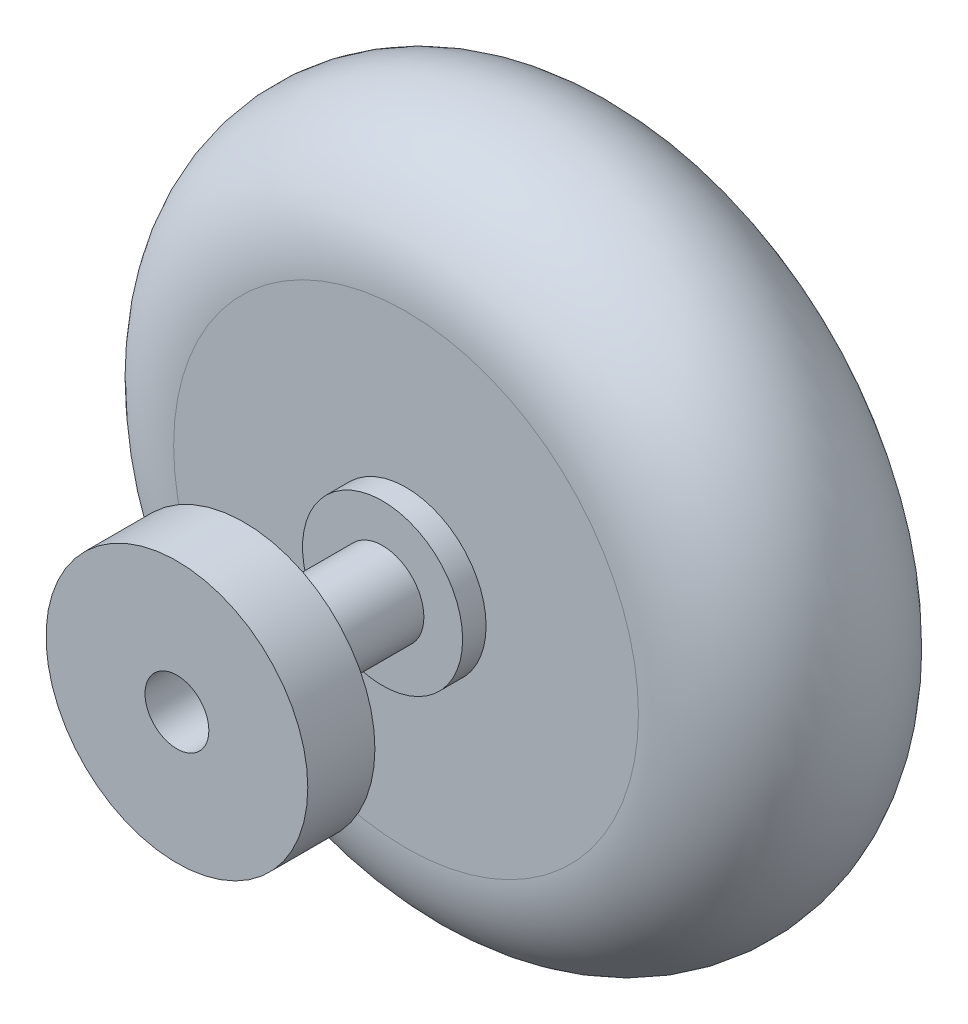
ISO-10303-21;
HEADER;
FILE_DESCRIPTION(('STEP AP214'),'2;1');
FILE_NAME('part.step','',(''),(''),'','','');
FILE_SCHEMA(('AUTOMOTIVE_DESIGN { 1 0 10303 214 1 1 1 1 }'));
ENDSEC;
DATA;
#1=APPLICATION_CONTEXT('core data for automotive mechanical design processes');
#2=APPLICATION_PROTOCOL_DEFINITION('international standard','automotive_design',2000,#1);
#3=PRODUCT_CONTEXT('',#1,'mechanical');
#4=PRODUCT('Part','Part','',(#3));
#5=PRODUCT_RELATED_PRODUCT_CATEGORY('part','',(#4));
#6=PRODUCT_DEFINITION_FORMATION('','',#4);
#7=PRODUCT_DEFINITION_CONTEXT('part definition',#1,'design');
#8=PRODUCT_DEFINITION('design','',#6,#7);
#9=PRODUCT_DEFINITION_SHAPE('','',#8);
#10=(LENGTH_UNIT() NAMED_UNIT(*) SI_UNIT(.MILLI.,.METRE.));
#11=(NAMED_UNIT(*) PLANE_ANGLE_UNIT() SI_UNIT($,.RADIAN.));
#12=(NAMED_UNIT(*) SI_UNIT($,.STERADIAN.) SOLID_ANGLE_UNIT());
#13=UNCERTAINTY_MEASURE_WITH_UNIT(LENGTH_MEASURE(1.E-05),#10,'distance_accuracy_value','');
#14=(GEOMETRIC_REPRESENTATION_CONTEXT(3) GLOBAL_UNCERTAINTY_ASSIGNED_CONTEXT((#13)) GLOBAL_UNIT_ASSIGNED_CONTEXT((#10,
#11,#12)) REPRESENTATION_CONTEXT('',''));
#15=CARTESIAN_POINT('',(0.,0.,0.));
#16=DIRECTION('',(0.,0.,1.));
#17=DIRECTION('',(1.,0.,0.));
#18=AXIS2_PLACEMENT_3D('',#15,#16,#17);
#19=CARTESIAN_POINT('',(0.,0.,-5.));
#20=DIRECTION('',(0.,0.,1.));
#21=DIRECTION('',(1.,0.,0.));
#22=AXIS2_PLACEMENT_3D('',#19,#20,#21);
#23=TOROIDAL_SURFACE('',#22,9.9,5.);
#24=CARTESIAN_POINT('',(0.,0.,-10.));
#25=DIRECTION('',(0.,0.,1.));
#26=DIRECTION('',(1.,0.,0.));
#27=AXIS2_PLACEMENT_3D('',#24,#25,#26);
#28=CIRCLE('',#27,9.9);
#29=CARTESIAN_POINT('',(9.9,0.,-10.));
#30=VERTEX_POINT('',#29);
#31=EDGE_CURVE('E116',#30,#30,#28,.F.);
#32=ORIENTED_EDGE('',*,*,#31,.F.);
#33=EDGE_LOOP('',(#32));
#34=FACE_BOUND('',#33,.T.);
#35=CARTESIAN_POINT('',(0.,0.,0.));
#36=DIRECTION('',(0.,0.,1.));
#37=DIRECTION('',(1.,0.,0.));
#38=AXIS2_PLACEMENT_3D('',#35,#36,#37);
#39=CIRCLE('',#38,9.9);
#40=CARTESIAN_POINT('',(9.9,0.,0.));
#41=VERTEX_POINT('',#40);
#42=EDGE_CURVE('E111',#41,#41,#39,.T.);
#43=ORIENTED_EDGE('',*,*,#42,.F.);
#44=EDGE_LOOP('',(#43));
#45=FACE_BOUND('',#44,.T.);
#46=ADVANCED_FACE('F42',(#34,#45),#23,.T.);
#47=CARTESIAN_POINT('',(0.,0.,-10.));
#48=DIRECTION('',(0.,0.,1.));
#49=DIRECTION('',(1.,0.,0.));
#50=AXIS2_PLACEMENT_3D('',#47,#48,#49);
#51=PLANE('',#50);
#52=CARTESIAN_POINT('',(0.,0.,-10.));
#53=DIRECTION('',(0.,0.,1.));
#54=DIRECTION('',(1.,0.,0.));
#55=AXIS2_PLACEMENT_3D('',#52,#53,#54);
#56=CIRCLE('',#55,3.405);
#57=CARTESIAN_POINT('',(3.405,0.,-10.));
#58=VERTEX_POINT('',#57);
#59=EDGE_CURVE('E46',#58,#58,#56,.F.);
#60=ORIENTED_EDGE('',*,*,#59,.F.);
#61=EDGE_LOOP('',(#60));
#62=FACE_BOUND('',#61,.T.);
#63=ORIENTED_EDGE('',*,*,#31,.T.);
#64=EDGE_LOOP('',(#63));
#65=FACE_BOUND('',#64,.T.);
#66=ADVANCED_FACE('F130',(#62,#65),#51,.F.);
#67=CARTESIAN_POINT('',(0.,0.,0.));
#68=DIRECTION('',(0.,0.,1.));
#69=DIRECTION('',(1.,0.,0.));
#70=AXIS2_PLACEMENT_3D('',#67,#68,#69);
#71=PLANE('',#70);
#72=CARTESIAN_POINT('',(0.,0.,0.));
#73=DIRECTION('',(0.,0.,1.));
#74=DIRECTION('',(1.,0.,0.));
#75=AXIS2_PLACEMENT_3D('',#72,#73,#74);
#76=CIRCLE('',#75,3.41);
#77=CARTESIAN_POINT('',(3.41,0.,0.));
#78=VERTEX_POINT('',#77);
#79=EDGE_CURVE('E106',#78,#78,#76,.T.);
#80=ORIENTED_EDGE('',*,*,#79,.F.);
#81=EDGE_LOOP('',(#80));
#82=FACE_BOUND('',#81,.T.);
#83=ORIENTED_EDGE('',*,*,#42,.T.);
#84=EDGE_LOOP('',(#83));
#85=FACE_BOUND('',#84,.T.);
#86=ADVANCED_FACE('F127',(#82,#85),#71,.T.);
#87=CARTESIAN_POINT('',(0.,0.,1.));
#88=DIRECTION('',(0.,0.,-1.));
#89=DIRECTION('',(-1.,0.,0.));
#90=AXIS2_PLACEMENT_3D('',#87,#88,#89);
#91=CYLINDRICAL_SURFACE('',#90,3.41);
#92=CARTESIAN_POINT('',(0.,0.,1.));
#93=DIRECTION('',(0.,0.,1.));
#94=DIRECTION('',(1.,0.,0.));
#95=AXIS2_PLACEMENT_3D('',#92,#93,#94);
#96=CIRCLE('',#95,3.41);
#97=CARTESIAN_POINT('',(3.41,0.,1.));
#98=VERTEX_POINT('',#97);
#99=EDGE_CURVE('E112',#98,#98,#96,.T.);
#100=ORIENTED_EDGE('',*,*,#99,.F.);
#101=EDGE_LOOP('',(#100));
#102=FACE_BOUND('',#101,.T.);
#103=ORIENTED_EDGE('',*,*,#79,.T.);
#104=EDGE_LOOP('',(#103));
#105=FACE_BOUND('',#104,.T.);
#106=ADVANCED_FACE('F142',(#102,#105),#91,.T.);
#107=CARTESIAN_POINT('',(0.,0.,1.));
#108=DIRECTION('',(0.,0.,1.));
#109=DIRECTION('',(1.,0.,0.));
#110=AXIS2_PLACEMENT_3D('',#107,#108,#109);
#111=PLANE('',#110);
#112=CARTESIAN_POINT('',(0.,0.,1.));
#113=DIRECTION('',(0.,0.,1.));
#114=DIRECTION('',(1.,0.,0.));
#115=AXIS2_PLACEMENT_3D('',#112,#113,#114);
#116=CIRCLE('',#115,1.76);
#117=CARTESIAN_POINT('',(1.76,0.,1.));
#118=VERTEX_POINT('',#117);
#119=EDGE_CURVE('E107',#118,#118,#116,.T.);
#120=ORIENTED_EDGE('',*,*,#119,.F.);
#121=EDGE_LOOP('',(#120));
#122=FACE_BOUND('',#121,.T.);
#123=ORIENTED_EDGE('',*,*,#99,.T.);
#124=EDGE_LOOP('',(#123));
#125=FACE_BOUND('',#124,.T.);
#126=ADVANCED_FACE('F148',(#122,#125),#111,.T.);
#127=CARTESIAN_POINT('',(0.,0.,6.9));
#128=DIRECTION('',(0.,0.,-1.));
#129=DIRECTION('',(-1.,0.,0.));
#130=AXIS2_PLACEMENT_3D('',#127,#128,#129);
#131=CYLINDRICAL_SURFACE('',#130,1.76);
#132=CARTESIAN_POINT('',(0.,0.,6.9));
#133=DIRECTION('',(0.,0.,1.));
#134=DIRECTION('',(1.,0.,0.));
#135=AXIS2_PLACEMENT_3D('',#132,#133,#134);
#136=CIRCLE('',#135,1.76);
#137=CARTESIAN_POINT('',(1.76,0.,6.9));
#138=VERTEX_POINT('',#137);
#139=EDGE_CURVE('E99',#138,#138,#136,.T.);
#140=ORIENTED_EDGE('',*,*,#139,.F.);
#141=EDGE_LOOP('',(#140));
#142=FACE_BOUND('',#141,.T.);
#143=ORIENTED_EDGE('',*,*,#119,.T.);
#144=EDGE_LOOP('',(#143));
#145=FACE_BOUND('',#144,.T.);
#146=ADVANCED_FACE('F152',(#142,#145),#131,.T.);
#147=CARTESIAN_POINT('',(0.,0.,9.76));
#148=DIRECTION('',(0.,0.,-1.));
#149=DIRECTION('',(-1.,0.,0.));
#150=AXIS2_PLACEMENT_3D('',#147,#148,#149);
#151=CYLINDRICAL_SURFACE('',#150,5.575);
#152=CARTESIAN_POINT('',(0.,0.,9.76));
#153=DIRECTION('',(0.,0.,1.));
#154=DIRECTION('',(1.,0.,0.));
#155=AXIS2_PLACEMENT_3D('',#152,#153,#154);
#156=CIRCLE('',#155,5.575);
#157=CARTESIAN_POINT('',(5.575,0.,9.76));
#158=VERTEX_POINT('',#157);
#159=EDGE_CURVE('E95',#158,#158,#156,.T.);
#160=ORIENTED_EDGE('',*,*,#159,.F.);
#161=EDGE_LOOP('',(#160));
#162=FACE_BOUND('',#161,.T.);
#163=CARTESIAN_POINT('',(0.,0.,6.9));
#164=DIRECTION('',(0.,0.,1.));
#165=DIRECTION('',(1.,0.,0.));
#166=AXIS2_PLACEMENT_3D('',#163,#164,#165);
#167=CIRCLE('',#166,5.575);
#168=CARTESIAN_POINT('',(5.575,0.,6.9));
#169=VERTEX_POINT('',#168);
#170=EDGE_CURVE('E91',#169,#169,#167,.T.);
#171=ORIENTED_EDGE('',*,*,#170,.T.);
#172=EDGE_LOOP('',(#171));
#173=FACE_BOUND('',#172,.T.);
#174=ADVANCED_FACE('F156',(#162,#173),#151,.T.);
#175=CARTESIAN_POINT('',(0.,0.,9.76));
#176=DIRECTION('',(0.,0.,1.));
#177=DIRECTION('',(1.,0.,0.));
#178=AXIS2_PLACEMENT_3D('',#175,#176,#177);
#179=PLANE('',#178);
#180=CARTESIAN_POINT('',(0.,0.,9.76));
#181=DIRECTION('',(0.,0.,1.));
#182=DIRECTION('',(1.,0.,0.));
#183=AXIS2_PLACEMENT_3D('',#180,#181,#182);
#184=CIRCLE('',#183,1.36);
#185=CARTESIAN_POINT('',(1.36,0.,9.76));
#186=VERTEX_POINT('',#185);
#187=EDGE_CURVE('E86',#186,#186,#184,.T.);
#188=ORIENTED_EDGE('',*,*,#187,.F.);
#189=EDGE_LOOP('',(#188));
#190=FACE_BOUND('',#189,.T.);
#191=ORIENTED_EDGE('',*,*,#159,.T.);
#192=EDGE_LOOP('',(#191));
#193=FACE_BOUND('',#192,.T.);
#194=ADVANCED_FACE('F160',(#190,#193),#179,.T.);
#195=CARTESIAN_POINT('',(0.,0.,6.9));
#196=DIRECTION('',(0.,0.,1.));
#197=DIRECTION('',(1.,0.,0.));
#198=AXIS2_PLACEMENT_3D('',#195,#196,#197);
#199=PLANE('',#198);
#200=ORIENTED_EDGE('',*,*,#139,.T.);
#201=EDGE_LOOP('',(#200));
#202=FACE_BOUND('',#201,.T.);
#203=ORIENTED_EDGE('',*,*,#170,.F.);
#204=EDGE_LOOP('',(#203));
#205=FACE_BOUND('',#204,.T.);
#206=ADVANCED_FACE('F162',(#202,#205),#199,.F.);
#207=CARTESIAN_POINT('',(0.,0.,6.9));
#208=DIRECTION('',(0.,0.,1.));
#209=DIRECTION('',(1.,0.,0.));
#210=AXIS2_PLACEMENT_3D('',#207,#208,#209);
#211=CYLINDRICAL_SURFACE('',#210,1.36);
#212=CARTESIAN_POINT('',(0.,0.,6.9));
#213=DIRECTION('',(0.,0.,1.));
#214=DIRECTION('',(1.,0.,0.));
#215=AXIS2_PLACEMENT_3D('',#212,#213,#214);
#216=CIRCLE('',#215,1.36);
#217=CARTESIAN_POINT('',(1.36,0.,6.9));
#218=VERTEX_POINT('',#217);
#219=EDGE_CURVE('E87',#218,#218,#216,.T.);
#220=ORIENTED_EDGE('',*,*,#219,.F.);
#221=EDGE_LOOP('',(#220));
#222=FACE_BOUND('',#221,.T.);
#223=ORIENTED_EDGE('',*,*,#187,.T.);
#224=EDGE_LOOP('',(#223));
#225=FACE_BOUND('',#224,.T.);
#226=ADVANCED_FACE('F165',(#222,#225),#211,.F.);
#227=CARTESIAN_POINT('',(0.,0.,6.9));
#228=DIRECTION('',(0.,0.,1.));
#229=DIRECTION('',(1.,0.,0.));
#230=AXIS2_PLACEMENT_3D('',#227,#228,#229);
#231=PLANE('',#230);
#232=ORIENTED_EDGE('',*,*,#219,.T.);
#233=EDGE_LOOP('',(#232));
#234=FACE_BOUND('',#233,.T.);
#235=ADVANCED_FACE('F172',(#234),#231,.T.);
#236=CARTESIAN_POINT('',(0.,0.,-10.5));
#237=DIRECTION('',(0.,0.,1.));
#238=DIRECTION('',(1.,0.,0.));
#239=AXIS2_PLACEMENT_3D('',#236,#237,#238);
#240=CYLINDRICAL_SURFACE('',#239,3.405);
#241=CARTESIAN_POINT('',(0.,0.,-10.5));
#242=DIRECTION('',(0.,0.,-1.));
#243=DIRECTION('',(-1.,0.,0.));
#244=AXIS2_PLACEMENT_3D('',#241,#242,#243);
#245=CIRCLE('',#244,3.405);
#246=CARTESIAN_POINT('',(-3.405,0.,-10.5));
#247=VERTEX_POINT('',#246);
#248=EDGE_CURVE('E79',#247,#247,#245,.T.);
#249=ORIENTED_EDGE('',*,*,#248,.F.);
#250=EDGE_LOOP('',(#249));
#251=FACE_BOUND('',#250,.T.);
#252=ORIENTED_EDGE('',*,*,#59,.T.);
#253=EDGE_LOOP('',(#252));
#254=FACE_BOUND('',#253,.T.);
#255=ADVANCED_FACE('F176',(#251,#254),#240,.T.);
#256=CARTESIAN_POINT('',(0.,0.,-10.5));
#257=DIRECTION('',(0.,0.,-1.));
#258=DIRECTION('',(-1.,0.,0.));
#259=AXIS2_PLACEMENT_3D('',#256,#257,#258);
#260=PLANE('',#259);
#261=CARTESIAN_POINT('',(0.,0.,-10.5));
#262=DIRECTION('',(0.,0.,-1.));
#263=DIRECTION('',(-1.,0.,0.));
#264=AXIS2_PLACEMENT_3D('',#261,#262,#263);
#265=CIRCLE('',#264,1.79);
#266=CARTESIAN_POINT('',(-1.79,0.,-10.5));
#267=VERTEX_POINT('',#266);
#268=EDGE_CURVE('E58',#267,#267,#265,.T.);
#269=ORIENTED_EDGE('',*,*,#268,.F.);
#270=EDGE_LOOP('',(#269));
#271=FACE_BOUND('',#270,.T.);
#272=ORIENTED_EDGE('',*,*,#248,.T.);
#273=EDGE_LOOP('',(#272));
#274=FACE_BOUND('',#273,.T.);
#275=ADVANCED_FACE('F180',(#271,#274),#260,.T.);
#276=CARTESIAN_POINT('',(0.,0.,-12.42));
#277=DIRECTION('',(0.,0.,1.));
#278=DIRECTION('',(1.,0.,0.));
#279=AXIS2_PLACEMENT_3D('',#276,#277,#278);
#280=CYLINDRICAL_SURFACE('',#279,1.79);
#281=CARTESIAN_POINT('',(0.,0.,-12.42));
#282=DIRECTION('',(0.,0.,-1.));
#283=DIRECTION('',(-1.,0.,0.));
#284=AXIS2_PLACEMENT_3D('',#281,#282,#283);
#285=CIRCLE('',#284,1.79);
#286=CARTESIAN_POINT('',(-1.79,0.,-12.42));
#287=VERTEX_POINT('',#286);
#288=EDGE_CURVE('E72',#287,#287,#285,.T.);
#289=ORIENTED_EDGE('',*,*,#288,.F.);
#290=EDGE_LOOP('',(#289));
#291=FACE_BOUND('',#290,.T.);
#292=ORIENTED_EDGE('',*,*,#268,.T.);
#293=EDGE_LOOP('',(#292));
#294=FACE_BOUND('',#293,.T.);
#295=ADVANCED_FACE('F184',(#291,#294),#280,.T.);
#296=CARTESIAN_POINT('',(0.,0.,-13.54));
#297=DIRECTION('',(0.,0.,1.));
#298=DIRECTION('',(1.,0.,0.));
#299=AXIS2_PLACEMENT_3D('',#296,#297,#298);
#300=CYLINDRICAL_SURFACE('',#299,2.85);
#301=CARTESIAN_POINT('',(0.,0.,-13.54));
#302=DIRECTION('',(0.,0.,-1.));
#303=DIRECTION('',(-1.,0.,0.));
#304=AXIS2_PLACEMENT_3D('',#301,#302,#303);
#305=CIRCLE('',#304,2.85);
#306=CARTESIAN_POINT('',(-2.85,0.,-13.54));
#307=VERTEX_POINT('',#306);
#308=EDGE_CURVE('E68',#307,#307,#305,.T.);
#309=ORIENTED_EDGE('',*,*,#308,.F.);
#310=EDGE_LOOP('',(#309));
#311=FACE_BOUND('',#310,.T.);
#312=CARTESIAN_POINT('',(0.,0.,-12.42));
#313=DIRECTION('',(0.,0.,-1.));
#314=DIRECTION('',(-1.,0.,0.));
#315=AXIS2_PLACEMENT_3D('',#312,#313,#314);
#316=CIRCLE('',#315,2.85);
#317=CARTESIAN_POINT('',(-2.85,0.,-12.42));
#318=VERTEX_POINT('',#317);
#319=EDGE_CURVE('E67',#318,#318,#316,.T.);
#320=ORIENTED_EDGE('',*,*,#319,.T.);
#321=EDGE_LOOP('',(#320));
#322=FACE_BOUND('',#321,.T.);
#323=ADVANCED_FACE('F188',(#311,#322),#300,.T.);
#324=CARTESIAN_POINT('',(0.,0.,-13.54));
#325=DIRECTION('',(0.,0.,-1.));
#326=DIRECTION('',(-1.,0.,0.));
#327=AXIS2_PLACEMENT_3D('',#324,#325,#326);
#328=PLANE('',#327);
#329=CARTESIAN_POINT('',(0.,0.,-13.54));
#330=DIRECTION('',(0.,0.,-1.));
#331=DIRECTION('',(-1.,0.,0.));
#332=AXIS2_PLACEMENT_3D('',#329,#330,#331);
#333=CIRCLE('',#332,1.11);
#334=CARTESIAN_POINT('',(-1.11,0.,-13.54));
#335=VERTEX_POINT('',#334);
#336=EDGE_CURVE('E51',#335,#335,#333,.T.);
#337=ORIENTED_EDGE('',*,*,#336,.F.);
#338=EDGE_LOOP('',(#337));
#339=FACE_BOUND('',#338,.T.);
#340=ORIENTED_EDGE('',*,*,#308,.T.);
#341=EDGE_LOOP('',(#340));
#342=FACE_BOUND('',#341,.T.);
#343=ADVANCED_FACE('F192',(#339,#342),#328,.T.);
#344=CARTESIAN_POINT('',(0.,0.,-12.42));
#345=DIRECTION('',(0.,0.,-1.));
#346=DIRECTION('',(-1.,0.,0.));
#347=AXIS2_PLACEMENT_3D('',#344,#345,#346);
#348=PLANE('',#347);
#349=ORIENTED_EDGE('',*,*,#288,.T.);
#350=EDGE_LOOP('',(#349));
#351=FACE_BOUND('',#350,.T.);
#352=ORIENTED_EDGE('',*,*,#319,.F.);
#353=EDGE_LOOP('',(#352));
#354=FACE_BOUND('',#353,.T.);
#355=ADVANCED_FACE('F194',(#351,#354),#348,.F.);
#356=CARTESIAN_POINT('',(0.,0.,-13.54));
#357=DIRECTION('',(0.,0.,1.));
#358=DIRECTION('',(-1.,0.,0.));
#359=AXIS2_PLACEMENT_3D('',#356,#357,#358);
#360=CONICAL_SURFACE('',#359,1.11,0.0872664625997167);
#361=CARTESIAN_POINT('',(0.,0.,-15.04));
#362=DIRECTION('',(0.,0.,-1.));
#363=DIRECTION('',(-1.,0.,0.));
#364=AXIS2_PLACEMENT_3D('',#361,#362,#363);
#365=CIRCLE('',#364,0.978767004711114);
#366=CARTESIAN_POINT('',(-0.978767004711114,0.,-15.04));
#367=VERTEX_POINT('',#366);
#368=EDGE_CURVE('E63',#367,#367,#365,.T.);
#369=ORIENTED_EDGE('',*,*,#368,.F.);
#370=EDGE_LOOP('',(#369));
#371=FACE_BOUND('',#370,.T.);
#372=ORIENTED_EDGE('',*,*,#336,.T.);
#373=EDGE_LOOP('',(#372));
#374=FACE_BOUND('',#373,.T.);
#375=ADVANCED_FACE('F197',(#371,#374),#360,.T.);
#376=CARTESIAN_POINT('',(0.,0.,-15.04));
#377=DIRECTION('',(0.,0.,-1.));
#378=DIRECTION('',(-1.,0.,0.));
#379=AXIS2_PLACEMENT_3D('',#376,#377,#378);
#380=PLANE('',#379);
#381=CARTESIAN_POINT('',(0.,0.,-15.04));
#382=DIRECTION('',(0.,0.,-1.));
#383=DIRECTION('',(-1.,0.,0.));
#384=AXIS2_PLACEMENT_3D('',#381,#382,#383);
#385=CIRCLE('',#384,0.76);
#386=CARTESIAN_POINT('',(-0.76,0.,-15.04));
#387=VERTEX_POINT('',#386);
#388=EDGE_CURVE('E10',#387,#387,#385,.T.);
#389=ORIENTED_EDGE('',*,*,#388,.F.);
#390=EDGE_LOOP('',(#389));
#391=FACE_BOUND('',#390,.T.);
#392=ORIENTED_EDGE('',*,*,#368,.T.);
#393=EDGE_LOOP('',(#392));
#394=FACE_BOUND('',#393,.T.);
#395=ADVANCED_FACE('F204',(#391,#394),#380,.T.);
#396=CARTESIAN_POINT('',(0.,0.,-17.28));
#397=DIRECTION('',(0.,0.,1.));
#398=DIRECTION('',(1.,0.,0.));
#399=AXIS2_PLACEMENT_3D('',#396,#397,#398);
#400=CYLINDRICAL_SURFACE('',#399,0.76);
#401=CARTESIAN_POINT('',(0.,0.,-17.28));
#402=DIRECTION('',(0.,0.,-1.));
#403=DIRECTION('',(-1.,0.,0.));
#404=AXIS2_PLACEMENT_3D('',#401,#402,#403);
#405=CIRCLE('',#404,0.76);
#406=CARTESIAN_POINT('',(-0.76,0.,-17.28));
#407=VERTEX_POINT('',#406);
#408=EDGE_CURVE('E61',#407,#407,#405,.T.);
#409=ORIENTED_EDGE('',*,*,#408,.F.);
#410=EDGE_LOOP('',(#409));
#411=FACE_BOUND('',#410,.T.);
#412=ORIENTED_EDGE('',*,*,#388,.T.);
#413=EDGE_LOOP('',(#412));
#414=FACE_BOUND('',#413,.T.);
#415=ADVANCED_FACE('F208',(#411,#414),#400,.T.);
#416=CARTESIAN_POINT('',(0.,0.,-17.28));
#417=DIRECTION('',(0.,0.,-1.));
#418=DIRECTION('',(-1.,0.,0.));
#419=AXIS2_PLACEMENT_3D('',#416,#417,#418);
#420=PLANE('',#419);
#421=ORIENTED_EDGE('',*,*,#408,.T.);
#422=EDGE_LOOP('',(#421));
#423=FACE_BOUND('',#422,.T.);
#424=ADVANCED_FACE('F212',(#423),#420,.T.);
#425=CLOSED_SHELL('',(#46,#66,#86,#106,#126,#146,#174,#194,#206,#226,#235,#255,#275,#295,#323,
#343,#355,#375,#395,#415,#424));
#426=MANIFOLD_SOLID_BREP('B2',#425);
#427=ADVANCED_BREP_SHAPE_REPRESENTATION('',(#18,#426),#14);
#428=SHAPE_DEFINITION_REPRESENTATION(#9,#427);
ENDSEC;
END-ISO-10303-21;
